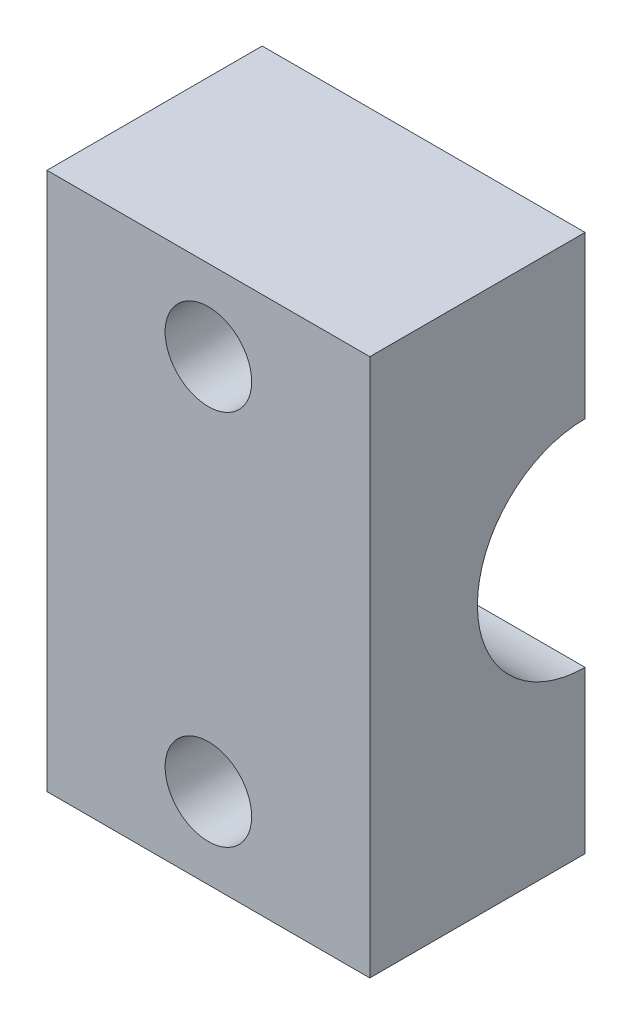
ISO-10303-21;
HEADER;
FILE_DESCRIPTION(('STEP AP214'),'2;1');
FILE_NAME('part.step','',(''),(''),'','','');
FILE_SCHEMA(('AUTOMOTIVE_DESIGN { 1 0 10303 214 1 1 1 1 }'));
ENDSEC;
DATA;
#1=APPLICATION_CONTEXT('core data for automotive mechanical design processes');
#2=APPLICATION_PROTOCOL_DEFINITION('international standard','automotive_design',2000,#1);
#3=PRODUCT_CONTEXT('',#1,'mechanical');
#4=PRODUCT('Part','Part','',(#3));
#5=PRODUCT_RELATED_PRODUCT_CATEGORY('part','',(#4));
#6=PRODUCT_DEFINITION_FORMATION('','',#4);
#7=PRODUCT_DEFINITION_CONTEXT('part definition',#1,'design');
#8=PRODUCT_DEFINITION('design','',#6,#7);
#9=PRODUCT_DEFINITION_SHAPE('','',#8);
#10=(LENGTH_UNIT() NAMED_UNIT(*) SI_UNIT(.MILLI.,.METRE.));
#11=(NAMED_UNIT(*) PLANE_ANGLE_UNIT() SI_UNIT($,.RADIAN.));
#12=(NAMED_UNIT(*) SI_UNIT($,.STERADIAN.) SOLID_ANGLE_UNIT());
#13=UNCERTAINTY_MEASURE_WITH_UNIT(LENGTH_MEASURE(1.E-05),#10,'distance_accuracy_value','');
#14=(GEOMETRIC_REPRESENTATION_CONTEXT(3) GLOBAL_UNCERTAINTY_ASSIGNED_CONTEXT((#13)) GLOBAL_UNIT_ASSIGNED_CONTEXT((#10,
#11,#12)) REPRESENTATION_CONTEXT('',''));
#15=CARTESIAN_POINT('',(0.,0.,0.));
#16=DIRECTION('',(0.,0.,1.));
#17=DIRECTION('',(1.,0.,0.));
#18=AXIS2_PLACEMENT_3D('',#15,#16,#17);
#19=CARTESIAN_POINT('',(0.,0.,0.));
#20=DIRECTION('',(0.,0.,1.));
#21=DIRECTION('',(1.,0.,0.));
#22=AXIS2_PLACEMENT_3D('',#19,#20,#21);
#23=PLANE('',#22);
#24=CARTESIAN_POINT('',(0.,-11.1125,0.));
#25=DIRECTION('',(0.,0.,1.));
#26=DIRECTION('',(1.,0.,0.));
#27=AXIS2_PLACEMENT_3D('',#24,#25,#26);
#28=CIRCLE('',#27,2.5527);
#29=CARTESIAN_POINT('',(2.5527,-11.1125,0.));
#30=VERTEX_POINT('',#29);
#31=EDGE_CURVE('E115',#30,#30,#28,.T.);
#32=ORIENTED_EDGE('',*,*,#31,.T.);
#33=EDGE_LOOP('',(#32));
#34=FACE_BOUND('',#33,.T.);
#35=DIRECTION('',(0.,-1.,0.));
#36=VECTOR('',#35,1.);
#37=CARTESIAN_POINT('',(-9.525,-15.875,0.));
#38=LINE('',#37,#36);
#39=CARTESIAN_POINT('',(-9.525,-6.35,0.));
#40=VERTEX_POINT('',#39);
#41=CARTESIAN_POINT('',(-9.525,-15.875,0.));
#42=VERTEX_POINT('',#41);
#43=EDGE_CURVE('E138',#40,#42,#38,.T.);
#44=ORIENTED_EDGE('',*,*,#43,.F.);
#45=DIRECTION('',(1.,0.,0.));
#46=VECTOR('',#45,1.);
#47=CARTESIAN_POINT('',(-9.525,-6.35,0.));
#48=LINE('',#47,#46);
#49=CARTESIAN_POINT('',(9.525,-6.35,0.));
#50=VERTEX_POINT('',#49);
#51=EDGE_CURVE('E11',#40,#50,#48,.T.);
#52=ORIENTED_EDGE('',*,*,#51,.T.);
#53=DIRECTION('',(0.,1.,0.));
#54=VECTOR('',#53,1.);
#55=CARTESIAN_POINT('',(9.525,-15.875,0.));
#56=LINE('',#55,#54);
#57=CARTESIAN_POINT('',(9.525,-15.875,0.));
#58=VERTEX_POINT('',#57);
#59=EDGE_CURVE('E114',#58,#50,#56,.T.);
#60=ORIENTED_EDGE('',*,*,#59,.F.);
#61=DIRECTION('',(1.,0.,0.));
#62=VECTOR('',#61,1.);
#63=CARTESIAN_POINT('',(9.525,-15.875,0.));
#64=LINE('',#63,#62);
#65=EDGE_CURVE('E118',#42,#58,#64,.T.);
#66=ORIENTED_EDGE('',*,*,#65,.F.);
#67=EDGE_LOOP('',(#44,#52,#60,#66));
#68=FACE_BOUND('',#67,.T.);
#69=ADVANCED_FACE('F39',(#34,#68),#23,.F.);
#70=CARTESIAN_POINT('',(-9.525,-15.875,12.7));
#71=DIRECTION('',(1.,0.,0.));
#72=DIRECTION('',(0.,0.,-1.));
#73=AXIS2_PLACEMENT_3D('',#70,#71,#72);
#74=PLANE('',#73);
#75=CARTESIAN_POINT('',(-9.525,15.875,0.));
#76=VERTEX_POINT('',#75);
#77=CARTESIAN_POINT('',(-9.525,6.35,0.));
#78=VERTEX_POINT('',#77);
#79=EDGE_CURVE('E120',#76,#78,#38,.T.);
#80=ORIENTED_EDGE('',*,*,#79,.T.);
#81=CARTESIAN_POINT('',(-9.525,0.,0.));
#82=DIRECTION('',(1.,0.,0.));
#83=DIRECTION('',(0.,0.,-1.));
#84=AXIS2_PLACEMENT_3D('',#81,#82,#83);
#85=CIRCLE('',#84,6.35);
#86=EDGE_CURVE('E54',#78,#40,#85,.T.);
#87=ORIENTED_EDGE('',*,*,#86,.T.);
#88=ORIENTED_EDGE('',*,*,#43,.T.);
#89=DIRECTION('',(0.,0.,-1.));
#90=VECTOR('',#89,1.);
#91=CARTESIAN_POINT('',(-9.525,-15.875,12.7));
#92=LINE('',#91,#90);
#93=CARTESIAN_POINT('',(-9.525,-15.875,12.7));
#94=VERTEX_POINT('',#93);
#95=EDGE_CURVE('E106',#94,#42,#92,.T.);
#96=ORIENTED_EDGE('',*,*,#95,.F.);
#97=DIRECTION('',(0.,-1.,0.));
#98=VECTOR('',#97,1.);
#99=CARTESIAN_POINT('',(-9.525,-15.875,12.7));
#100=LINE('',#99,#98);
#101=CARTESIAN_POINT('',(-9.525,15.875,12.7));
#102=VERTEX_POINT('',#101);
#103=EDGE_CURVE('E125',#102,#94,#100,.T.);
#104=ORIENTED_EDGE('',*,*,#103,.F.);
#105=DIRECTION('',(0.,0.,-1.));
#106=VECTOR('',#105,1.);
#107=CARTESIAN_POINT('',(-9.525,15.875,12.7));
#108=LINE('',#107,#106);
#109=EDGE_CURVE('E126',#102,#76,#108,.T.);
#110=ORIENTED_EDGE('',*,*,#109,.T.);
#111=EDGE_LOOP('',(#80,#87,#88,#96,#104,#110));
#112=FACE_BOUND('',#111,.T.);
#113=ADVANCED_FACE('F41',(#112),#74,.F.);
#114=CARTESIAN_POINT('',(9.525,-15.875,12.7));
#115=DIRECTION('',(0.,1.,0.));
#116=DIRECTION('',(0.,0.,1.));
#117=AXIS2_PLACEMENT_3D('',#114,#115,#116);
#118=PLANE('',#117);
#119=ORIENTED_EDGE('',*,*,#65,.T.);
#120=DIRECTION('',(0.,0.,-1.));
#121=VECTOR('',#120,1.);
#122=CARTESIAN_POINT('',(9.525,-15.875,12.7));
#123=LINE('',#122,#121);
#124=CARTESIAN_POINT('',(9.525,-15.875,12.7));
#125=VERTEX_POINT('',#124);
#126=EDGE_CURVE('E130',#125,#58,#123,.T.);
#127=ORIENTED_EDGE('',*,*,#126,.F.);
#128=DIRECTION('',(1.,0.,0.));
#129=VECTOR('',#128,1.);
#130=CARTESIAN_POINT('',(9.525,-15.875,12.7));
#131=LINE('',#130,#129);
#132=EDGE_CURVE('E92',#94,#125,#131,.T.);
#133=ORIENTED_EDGE('',*,*,#132,.F.);
#134=ORIENTED_EDGE('',*,*,#95,.T.);
#135=EDGE_LOOP('',(#119,#127,#133,#134));
#136=FACE_BOUND('',#135,.T.);
#137=ADVANCED_FACE('F133',(#136),#118,.F.);
#138=CARTESIAN_POINT('',(9.525,-15.875,12.7));
#139=DIRECTION('',(-1.,0.,0.));
#140=DIRECTION('',(0.,0.,1.));
#141=AXIS2_PLACEMENT_3D('',#138,#139,#140);
#142=PLANE('',#141);
#143=ORIENTED_EDGE('',*,*,#59,.T.);
#144=CARTESIAN_POINT('',(9.525,0.,0.));
#145=DIRECTION('',(1.,0.,0.));
#146=DIRECTION('',(0.,0.,-1.));
#147=AXIS2_PLACEMENT_3D('',#144,#145,#146);
#148=CIRCLE('',#147,6.35);
#149=CARTESIAN_POINT('',(9.525,6.35,0.));
#150=VERTEX_POINT('',#149);
#151=EDGE_CURVE('E101',#150,#50,#148,.T.);
#152=ORIENTED_EDGE('',*,*,#151,.F.);
#153=CARTESIAN_POINT('',(9.525,15.875,0.));
#154=VERTEX_POINT('',#153);
#155=EDGE_CURVE('E111',#150,#154,#56,.T.);
#156=ORIENTED_EDGE('',*,*,#155,.T.);
#157=DIRECTION('',(0.,0.,-1.));
#158=VECTOR('',#157,1.);
#159=CARTESIAN_POINT('',(9.525,15.875,12.7));
#160=LINE('',#159,#158);
#161=CARTESIAN_POINT('',(9.525,15.875,12.7));
#162=VERTEX_POINT('',#161);
#163=EDGE_CURVE('E128',#162,#154,#160,.T.);
#164=ORIENTED_EDGE('',*,*,#163,.F.);
#165=DIRECTION('',(0.,1.,0.));
#166=VECTOR('',#165,1.);
#167=CARTESIAN_POINT('',(9.525,-15.875,12.7));
#168=LINE('',#167,#166);
#169=EDGE_CURVE('E176',#125,#162,#168,.T.);
#170=ORIENTED_EDGE('',*,*,#169,.F.);
#171=ORIENTED_EDGE('',*,*,#126,.T.);
#172=EDGE_LOOP('',(#143,#152,#156,#164,#170,#171));
#173=FACE_BOUND('',#172,.T.);
#174=ADVANCED_FACE('F109',(#173),#142,.F.);
#175=CARTESIAN_POINT('',(9.525,15.875,12.7));
#176=DIRECTION('',(0.,-1.,0.));
#177=DIRECTION('',(0.,0.,-1.));
#178=AXIS2_PLACEMENT_3D('',#175,#176,#177);
#179=PLANE('',#178);
#180=DIRECTION('',(-1.,0.,0.));
#181=VECTOR('',#180,1.);
#182=CARTESIAN_POINT('',(9.525,15.875,0.));
#183=LINE('',#182,#181);
#184=EDGE_CURVE('E84',#154,#76,#183,.T.);
#185=ORIENTED_EDGE('',*,*,#184,.T.);
#186=ORIENTED_EDGE('',*,*,#109,.F.);
#187=DIRECTION('',(-1.,0.,0.));
#188=VECTOR('',#187,1.);
#189=CARTESIAN_POINT('',(9.525,15.875,12.7));
#190=LINE('',#189,#188);
#191=EDGE_CURVE('E63',#162,#102,#190,.T.);
#192=ORIENTED_EDGE('',*,*,#191,.F.);
#193=ORIENTED_EDGE('',*,*,#163,.T.);
#194=EDGE_LOOP('',(#185,#186,#192,#193));
#195=FACE_BOUND('',#194,.T.);
#196=ADVANCED_FACE('F158',(#195),#179,.F.);
#197=CARTESIAN_POINT('',(0.,0.,12.7));
#198=DIRECTION('',(0.,0.,1.));
#199=DIRECTION('',(1.,0.,0.));
#200=AXIS2_PLACEMENT_3D('',#197,#198,#199);
#201=PLANE('',#200);
#202=CARTESIAN_POINT('',(0.,11.1125,12.7));
#203=DIRECTION('',(0.,0.,1.));
#204=DIRECTION('',(1.,0.,0.));
#205=AXIS2_PLACEMENT_3D('',#202,#203,#204);
#206=CIRCLE('',#205,2.55269999999999);
#207=CARTESIAN_POINT('',(2.55269999999999,11.1125,12.7));
#208=VERTEX_POINT('',#207);
#209=EDGE_CURVE('E165',#208,#208,#206,.T.);
#210=ORIENTED_EDGE('',*,*,#209,.F.);
#211=EDGE_LOOP('',(#210));
#212=FACE_BOUND('',#211,.T.);
#213=CARTESIAN_POINT('',(0.,-11.1125,12.7));
#214=DIRECTION('',(0.,0.,1.));
#215=DIRECTION('',(1.,0.,0.));
#216=AXIS2_PLACEMENT_3D('',#213,#214,#215);
#217=CIRCLE('',#216,2.55269999999999);
#218=CARTESIAN_POINT('',(2.55269999999999,-11.1125,12.7));
#219=VERTEX_POINT('',#218);
#220=EDGE_CURVE('E164',#219,#219,#217,.T.);
#221=ORIENTED_EDGE('',*,*,#220,.F.);
#222=EDGE_LOOP('',(#221));
#223=FACE_BOUND('',#222,.T.);
#224=ORIENTED_EDGE('',*,*,#103,.T.);
#225=ORIENTED_EDGE('',*,*,#132,.T.);
#226=ORIENTED_EDGE('',*,*,#169,.T.);
#227=ORIENTED_EDGE('',*,*,#191,.T.);
#228=EDGE_LOOP('',(#224,#225,#226,#227));
#229=FACE_BOUND('',#228,.T.);
#230=ADVANCED_FACE('F150',(#212,#223,#229),#201,.T.);
#231=CARTESIAN_POINT('',(0.,11.1125,0.));
#232=DIRECTION('',(0.,0.,1.));
#233=DIRECTION('',(1.,0.,0.));
#234=AXIS2_PLACEMENT_3D('',#231,#232,#233);
#235=CIRCLE('',#234,2.5527);
#236=CARTESIAN_POINT('',(2.5527,11.1125,0.));
#237=VERTEX_POINT('',#236);
#238=EDGE_CURVE('E162',#237,#237,#235,.T.);
#239=ORIENTED_EDGE('',*,*,#238,.T.);
#240=EDGE_LOOP('',(#239));
#241=FACE_BOUND('',#240,.T.);
#242=ORIENTED_EDGE('',*,*,#155,.F.);
#243=DIRECTION('',(1.,0.,0.));
#244=VECTOR('',#243,1.);
#245=CARTESIAN_POINT('',(-9.525,6.35,0.));
#246=LINE('',#245,#244);
#247=EDGE_CURVE('E47',#150,#78,#246,.F.);
#248=ORIENTED_EDGE('',*,*,#247,.T.);
#249=ORIENTED_EDGE('',*,*,#79,.F.);
#250=ORIENTED_EDGE('',*,*,#184,.F.);
#251=EDGE_LOOP('',(#242,#248,#249,#250));
#252=FACE_BOUND('',#251,.T.);
#253=ADVANCED_FACE('F117',(#241,#252),#23,.F.);
#254=CARTESIAN_POINT('',(-9.525,0.,0.));
#255=DIRECTION('',(1.,0.,0.));
#256=DIRECTION('',(0.,0.,-1.));
#257=AXIS2_PLACEMENT_3D('',#254,#255,#256);
#258=CYLINDRICAL_SURFACE('',#257,6.35);
#259=ORIENTED_EDGE('',*,*,#86,.F.);
#260=ORIENTED_EDGE('',*,*,#247,.F.);
#261=ORIENTED_EDGE('',*,*,#151,.T.);
#262=ORIENTED_EDGE('',*,*,#51,.F.);
#263=EDGE_LOOP('',(#259,#260,#261,#262));
#264=FACE_BOUND('',#263,.T.);
#265=ADVANCED_FACE('F100',(#264),#258,.F.);
#266=CARTESIAN_POINT('',(0.,-11.1125,12.7));
#267=DIRECTION('',(0.,0.,1.));
#268=DIRECTION('',(1.,0.,0.));
#269=AXIS2_PLACEMENT_3D('',#266,#267,#268);
#270=CYLINDRICAL_SURFACE('',#269,2.55269999999999);
#271=ORIENTED_EDGE('',*,*,#31,.F.);
#272=EDGE_LOOP('',(#271));
#273=FACE_BOUND('',#272,.T.);
#274=ORIENTED_EDGE('',*,*,#220,.T.);
#275=EDGE_LOOP('',(#274));
#276=FACE_BOUND('',#275,.T.);
#277=ADVANCED_FACE('F156',(#273,#276),#270,.F.);
#278=CARTESIAN_POINT('',(0.,11.1125,12.7));
#279=DIRECTION('',(0.,0.,1.));
#280=DIRECTION('',(1.,0.,0.));
#281=AXIS2_PLACEMENT_3D('',#278,#279,#280);
#282=CYLINDRICAL_SURFACE('',#281,2.55269999999999);
#283=ORIENTED_EDGE('',*,*,#238,.F.);
#284=EDGE_LOOP('',(#283));
#285=FACE_BOUND('',#284,.T.);
#286=ORIENTED_EDGE('',*,*,#209,.T.);
#287=EDGE_LOOP('',(#286));
#288=FACE_BOUND('',#287,.T.);
#289=ADVANCED_FACE('F230',(#285,#288),#282,.F.);
#290=CLOSED_SHELL('',(#69,#113,#137,#174,#196,#230,#253,#265,#277,#289));
#291=MANIFOLD_SOLID_BREP('B2',#290);
#292=ADVANCED_BREP_SHAPE_REPRESENTATION('',(#18,#291),#14);
#293=SHAPE_DEFINITION_REPRESENTATION(#9,#292);
ENDSEC;
END-ISO-10303-21;
